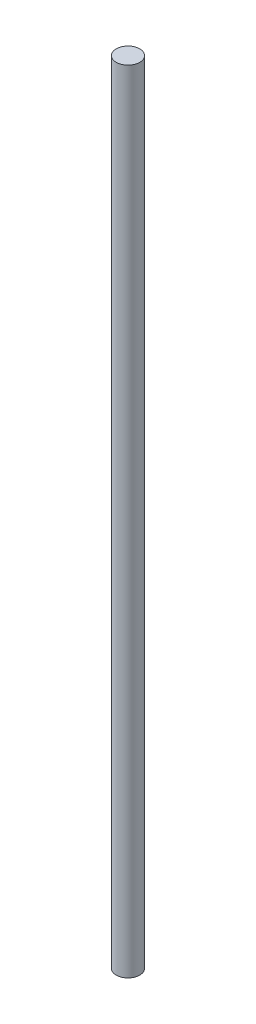
ISO-10303-21;
HEADER;
FILE_DESCRIPTION(('STEP AP214'),'2;1');
FILE_NAME('part.step','',(''),(''),'','','');
FILE_SCHEMA(('AUTOMOTIVE_DESIGN { 1 0 10303 214 1 1 1 1 }'));
ENDSEC;
DATA;
#1=APPLICATION_CONTEXT('core data for automotive mechanical design processes');
#2=APPLICATION_PROTOCOL_DEFINITION('international standard','automotive_design',2000,#1);
#3=PRODUCT_CONTEXT('',#1,'mechanical');
#4=PRODUCT('Part','Part','',(#3));
#5=PRODUCT_RELATED_PRODUCT_CATEGORY('part','',(#4));
#6=PRODUCT_DEFINITION_FORMATION('','',#4);
#7=PRODUCT_DEFINITION_CONTEXT('part definition',#1,'design');
#8=PRODUCT_DEFINITION('design','',#6,#7);
#9=PRODUCT_DEFINITION_SHAPE('','',#8);
#10=(LENGTH_UNIT() NAMED_UNIT(*) SI_UNIT(.MILLI.,.METRE.));
#11=(NAMED_UNIT(*) PLANE_ANGLE_UNIT() SI_UNIT($,.RADIAN.));
#12=(NAMED_UNIT(*) SI_UNIT($,.STERADIAN.) SOLID_ANGLE_UNIT());
#13=UNCERTAINTY_MEASURE_WITH_UNIT(LENGTH_MEASURE(1.E-05),#10,'distance_accuracy_value','');
#14=(GEOMETRIC_REPRESENTATION_CONTEXT(3) GLOBAL_UNCERTAINTY_ASSIGNED_CONTEXT((#13)) GLOBAL_UNIT_ASSIGNED_CONTEXT((#10,
#11,#12)) REPRESENTATION_CONTEXT('',''));
#15=CARTESIAN_POINT('',(0.,0.,0.));
#16=DIRECTION('',(0.,0.,1.));
#17=DIRECTION('',(1.,0.,0.));
#18=AXIS2_PLACEMENT_3D('',#15,#16,#17);
#19=CARTESIAN_POINT('',(0.,135.,0.));
#20=DIRECTION('',(0.,-1.,0.));
#21=DIRECTION('',(0.,0.,-1.));
#22=AXIS2_PLACEMENT_3D('',#19,#20,#21);
#23=CYLINDRICAL_SURFACE('',#22,2.);
#24=CARTESIAN_POINT('',(0.,135.,0.));
#25=DIRECTION('',(0.,1.,0.));
#26=DIRECTION('',(0.,0.,1.));
#27=AXIS2_PLACEMENT_3D('',#24,#25,#26);
#28=CIRCLE('',#27,2.);
#29=CARTESIAN_POINT('',(0.,135.,2.));
#30=VERTEX_POINT('',#29);
#31=EDGE_CURVE('E10',#30,#30,#28,.T.);
#32=ORIENTED_EDGE('',*,*,#31,.F.);
#33=EDGE_LOOP('',(#32));
#34=FACE_BOUND('',#33,.T.);
#35=CARTESIAN_POINT('',(0.,0.,0.));
#36=DIRECTION('',(0.,1.,0.));
#37=DIRECTION('',(0.,0.,1.));
#38=AXIS2_PLACEMENT_3D('',#35,#36,#37);
#39=CIRCLE('',#38,2.);
#40=CARTESIAN_POINT('',(0.,0.,2.));
#41=VERTEX_POINT('',#40);
#42=EDGE_CURVE('E38',#41,#41,#39,.T.);
#43=ORIENTED_EDGE('',*,*,#42,.T.);
#44=EDGE_LOOP('',(#43));
#45=FACE_BOUND('',#44,.T.);
#46=ADVANCED_FACE('F35',(#34,#45),#23,.T.);
#47=CARTESIAN_POINT('',(0.,135.,0.));
#48=DIRECTION('',(0.,1.,0.));
#49=DIRECTION('',(0.,0.,1.));
#50=AXIS2_PLACEMENT_3D('',#47,#48,#49);
#51=PLANE('',#50);
#52=ORIENTED_EDGE('',*,*,#31,.T.);
#53=EDGE_LOOP('',(#52));
#54=FACE_BOUND('',#53,.T.);
#55=ADVANCED_FACE('F50',(#54),#51,.T.);
#56=CARTESIAN_POINT('',(0.,0.,0.));
#57=DIRECTION('',(0.,1.,0.));
#58=DIRECTION('',(0.,0.,1.));
#59=AXIS2_PLACEMENT_3D('',#56,#57,#58);
#60=PLANE('',#59);
#61=ORIENTED_EDGE('',*,*,#42,.F.);
#62=EDGE_LOOP('',(#61));
#63=FACE_BOUND('',#62,.T.);
#64=ADVANCED_FACE('F48',(#63),#60,.F.);
#65=CLOSED_SHELL('',(#46,#55,#64));
#66=MANIFOLD_SOLID_BREP('B2',#65);
#67=ADVANCED_BREP_SHAPE_REPRESENTATION('',(#18,#66),#14);
#68=SHAPE_DEFINITION_REPRESENTATION(#9,#67);
ENDSEC;
END-ISO-10303-21;
